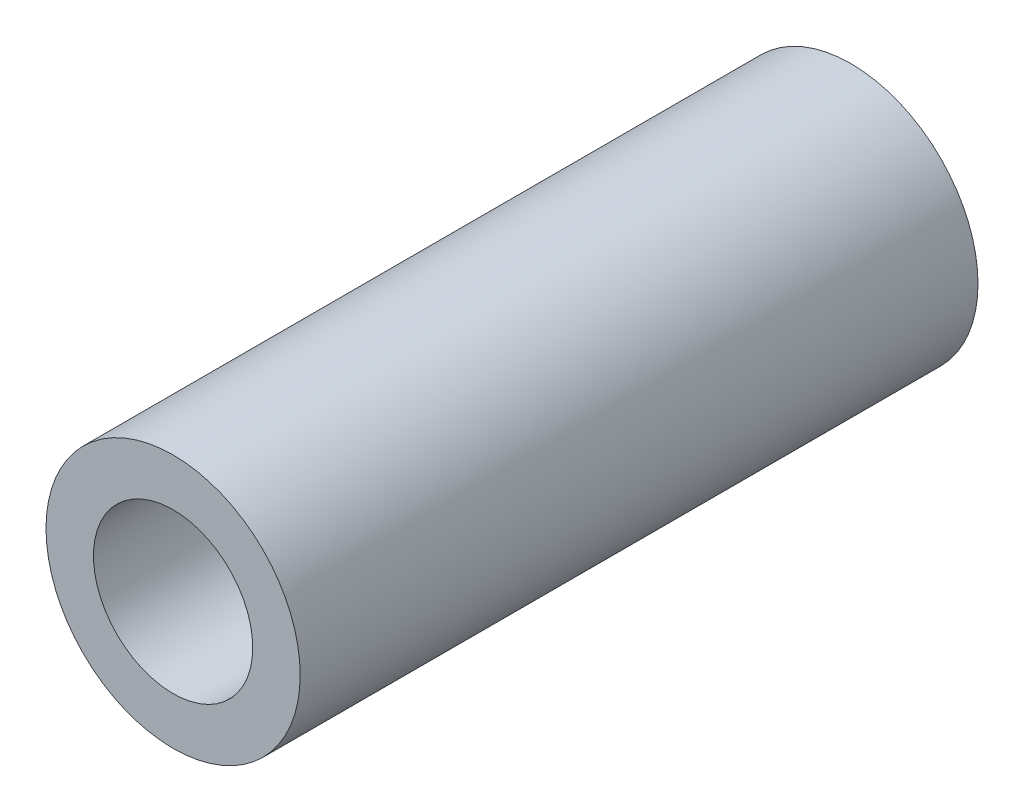
ISO-10303-21;
HEADER;
FILE_DESCRIPTION(('STEP AP214'),'2;1');
FILE_NAME('part.step','',(''),(''),'','','');
FILE_SCHEMA(('AUTOMOTIVE_DESIGN { 1 0 10303 214 1 1 1 1 }'));
ENDSEC;
DATA;
#1=APPLICATION_CONTEXT('core data for automotive mechanical design processes');
#2=APPLICATION_PROTOCOL_DEFINITION('international standard','automotive_design',2000,#1);
#3=PRODUCT_CONTEXT('',#1,'mechanical');
#4=PRODUCT('Part','Part','',(#3));
#5=PRODUCT_RELATED_PRODUCT_CATEGORY('part','',(#4));
#6=PRODUCT_DEFINITION_FORMATION('','',#4);
#7=PRODUCT_DEFINITION_CONTEXT('part definition',#1,'design');
#8=PRODUCT_DEFINITION('design','',#6,#7);
#9=PRODUCT_DEFINITION_SHAPE('','',#8);
#10=(LENGTH_UNIT() NAMED_UNIT(*) SI_UNIT(.MILLI.,.METRE.));
#11=(NAMED_UNIT(*) PLANE_ANGLE_UNIT() SI_UNIT($,.RADIAN.));
#12=(NAMED_UNIT(*) SI_UNIT($,.STERADIAN.) SOLID_ANGLE_UNIT());
#13=UNCERTAINTY_MEASURE_WITH_UNIT(LENGTH_MEASURE(1.E-05),#10,'distance_accuracy_value','');
#14=(GEOMETRIC_REPRESENTATION_CONTEXT(3) GLOBAL_UNCERTAINTY_ASSIGNED_CONTEXT((#13)) GLOBAL_UNIT_ASSIGNED_CONTEXT((#10,
#11,#12)) REPRESENTATION_CONTEXT('',''));
#15=CARTESIAN_POINT('',(0.,0.,0.));
#16=DIRECTION('',(0.,0.,1.));
#17=DIRECTION('',(1.,0.,0.));
#18=AXIS2_PLACEMENT_3D('',#15,#16,#17);
#19=CARTESIAN_POINT('',(0.,0.,25.4));
#20=DIRECTION('',(0.,0.,1.));
#21=DIRECTION('',(1.,0.,0.));
#22=AXIS2_PLACEMENT_3D('',#19,#20,#21);
#23=PLANE('',#22);
#24=CARTESIAN_POINT('',(0.,0.,25.4));
#25=DIRECTION('',(0.,0.,1.));
#26=DIRECTION('',(1.,0.,0.));
#27=AXIS2_PLACEMENT_3D('',#24,#25,#26);
#28=CIRCLE('',#27,4.7625);
#29=CARTESIAN_POINT('',(4.7625,0.,25.4));
#30=VERTEX_POINT('',#29);
#31=EDGE_CURVE('E10',#30,#30,#28,.T.);
#32=ORIENTED_EDGE('',*,*,#31,.T.);
#33=EDGE_LOOP('',(#32));
#34=FACE_BOUND('',#33,.T.);
#35=CARTESIAN_POINT('',(0.,0.,25.4));
#36=DIRECTION('',(0.,0.,1.));
#37=DIRECTION('',(1.,0.,0.));
#38=AXIS2_PLACEMENT_3D('',#35,#36,#37);
#39=CIRCLE('',#38,2.9845);
#40=CARTESIAN_POINT('',(2.9845,0.,25.4));
#41=VERTEX_POINT('',#40);
#42=EDGE_CURVE('E55',#41,#41,#39,.T.);
#43=ORIENTED_EDGE('',*,*,#42,.F.);
#44=EDGE_LOOP('',(#43));
#45=FACE_BOUND('',#44,.T.);
#46=ADVANCED_FACE('F41',(#34,#45),#23,.T.);
#47=CARTESIAN_POINT('',(0.,0.,0.));
#48=DIRECTION('',(0.,0.,1.));
#49=DIRECTION('',(1.,0.,0.));
#50=AXIS2_PLACEMENT_3D('',#47,#48,#49);
#51=PLANE('',#50);
#52=CARTESIAN_POINT('',(0.,0.,0.));
#53=DIRECTION('',(0.,0.,1.));
#54=DIRECTION('',(1.,0.,0.));
#55=AXIS2_PLACEMENT_3D('',#52,#53,#54);
#56=CIRCLE('',#55,4.7625);
#57=CARTESIAN_POINT('',(4.7625,0.,0.));
#58=VERTEX_POINT('',#57);
#59=EDGE_CURVE('E45',#58,#58,#56,.T.);
#60=ORIENTED_EDGE('',*,*,#59,.F.);
#61=EDGE_LOOP('',(#60));
#62=FACE_BOUND('',#61,.T.);
#63=CARTESIAN_POINT('',(0.,0.,0.));
#64=DIRECTION('',(0.,0.,1.));
#65=DIRECTION('',(1.,0.,0.));
#66=AXIS2_PLACEMENT_3D('',#63,#64,#65);
#67=CIRCLE('',#66,2.9845);
#68=CARTESIAN_POINT('',(2.9845,0.,0.));
#69=VERTEX_POINT('',#68);
#70=EDGE_CURVE('E57',#69,#69,#67,.T.);
#71=ORIENTED_EDGE('',*,*,#70,.T.);
#72=EDGE_LOOP('',(#71));
#73=FACE_BOUND('',#72,.T.);
#74=ADVANCED_FACE('F68',(#62,#73),#51,.F.);
#75=CARTESIAN_POINT('',(0.,0.,25.4));
#76=DIRECTION('',(0.,0.,-1.));
#77=DIRECTION('',(-1.,0.,0.));
#78=AXIS2_PLACEMENT_3D('',#75,#76,#77);
#79=CYLINDRICAL_SURFACE('',#78,4.7625);
#80=ORIENTED_EDGE('',*,*,#31,.F.);
#81=EDGE_LOOP('',(#80));
#82=FACE_BOUND('',#81,.T.);
#83=ORIENTED_EDGE('',*,*,#59,.T.);
#84=EDGE_LOOP('',(#83));
#85=FACE_BOUND('',#84,.T.);
#86=ADVANCED_FACE('F43',(#82,#85),#79,.T.);
#87=CARTESIAN_POINT('',(0.,0.,25.4));
#88=DIRECTION('',(0.,0.,-1.));
#89=DIRECTION('',(-1.,0.,0.));
#90=AXIS2_PLACEMENT_3D('',#87,#88,#89);
#91=CYLINDRICAL_SURFACE('',#90,2.9845);
#92=ORIENTED_EDGE('',*,*,#42,.T.);
#93=EDGE_LOOP('',(#92));
#94=FACE_BOUND('',#93,.T.);
#95=ORIENTED_EDGE('',*,*,#70,.F.);
#96=EDGE_LOOP('',(#95));
#97=FACE_BOUND('',#96,.T.);
#98=ADVANCED_FACE('F64',(#94,#97),#91,.F.);
#99=CLOSED_SHELL('',(#46,#74,#86,#98));
#100=MANIFOLD_SOLID_BREP('B2',#99);
#101=ADVANCED_BREP_SHAPE_REPRESENTATION('',(#18,#100),#14);
#102=SHAPE_DEFINITION_REPRESENTATION(#9,#101);
ENDSEC;
END-ISO-10303-21;
